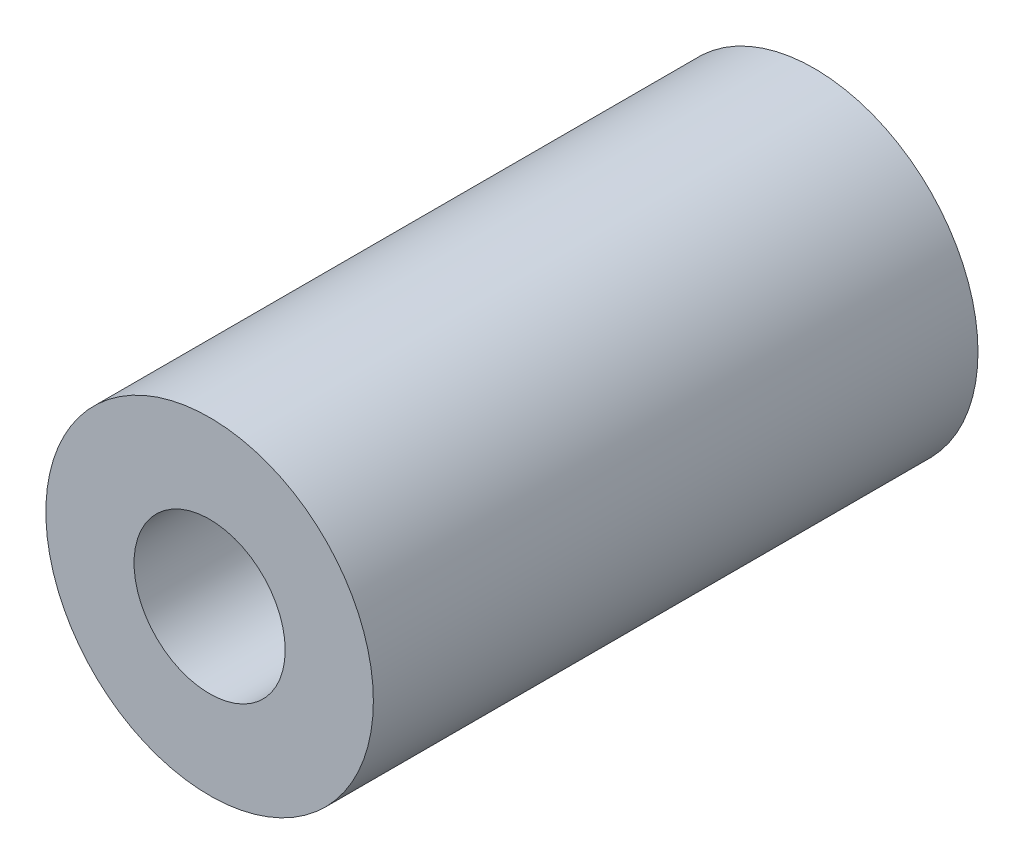
ISO-10303-21;
HEADER;
FILE_DESCRIPTION(('STEP AP214'),'2;1');
FILE_NAME('part.step','',(''),(''),'','','');
FILE_SCHEMA(('AUTOMOTIVE_DESIGN { 1 0 10303 214 1 1 1 1 }'));
ENDSEC;
DATA;
#1=APPLICATION_CONTEXT('core data for automotive mechanical design processes');
#2=APPLICATION_PROTOCOL_DEFINITION('international standard','automotive_design',2000,#1);
#3=PRODUCT_CONTEXT('',#1,'mechanical');
#4=PRODUCT('Part','Part','',(#3));
#5=PRODUCT_RELATED_PRODUCT_CATEGORY('part','',(#4));
#6=PRODUCT_DEFINITION_FORMATION('','',#4);
#7=PRODUCT_DEFINITION_CONTEXT('part definition',#1,'design');
#8=PRODUCT_DEFINITION('design','',#6,#7);
#9=PRODUCT_DEFINITION_SHAPE('','',#8);
#10=(LENGTH_UNIT() NAMED_UNIT(*) SI_UNIT(.MILLI.,.METRE.));
#11=(NAMED_UNIT(*) PLANE_ANGLE_UNIT() SI_UNIT($,.RADIAN.));
#12=(NAMED_UNIT(*) SI_UNIT($,.STERADIAN.) SOLID_ANGLE_UNIT());
#13=UNCERTAINTY_MEASURE_WITH_UNIT(LENGTH_MEASURE(1.E-05),#10,'distance_accuracy_value','');
#14=(GEOMETRIC_REPRESENTATION_CONTEXT(3) GLOBAL_UNCERTAINTY_ASSIGNED_CONTEXT((#13)) GLOBAL_UNIT_ASSIGNED_CONTEXT((#10,
#11,#12)) REPRESENTATION_CONTEXT('',''));
#15=CARTESIAN_POINT('',(0.,0.,0.));
#16=DIRECTION('',(0.,0.,1.));
#17=DIRECTION('',(1.,0.,0.));
#18=AXIS2_PLACEMENT_3D('',#15,#16,#17);
#19=CARTESIAN_POINT('',(0.,0.,12.));
#20=DIRECTION('',(0.,0.,1.));
#21=DIRECTION('',(1.,0.,0.));
#22=AXIS2_PLACEMENT_3D('',#19,#20,#21);
#23=PLANE('',#22);
#24=CARTESIAN_POINT('',(0.,0.,12.));
#25=DIRECTION('',(0.,0.,1.));
#26=DIRECTION('',(1.,0.,0.));
#27=AXIS2_PLACEMENT_3D('',#24,#25,#26);
#28=CIRCLE('',#27,3.25);
#29=CARTESIAN_POINT('',(3.25,0.,12.));
#30=VERTEX_POINT('',#29);
#31=EDGE_CURVE('E10',#30,#30,#28,.T.);
#32=ORIENTED_EDGE('',*,*,#31,.T.);
#33=EDGE_LOOP('',(#32));
#34=FACE_BOUND('',#33,.T.);
#35=CARTESIAN_POINT('',(0.,0.,12.));
#36=DIRECTION('',(0.,0.,1.));
#37=DIRECTION('',(1.,0.,0.));
#38=AXIS2_PLACEMENT_3D('',#35,#36,#37);
#39=CIRCLE('',#38,1.5);
#40=CARTESIAN_POINT('',(1.5,0.,12.));
#41=VERTEX_POINT('',#40);
#42=EDGE_CURVE('E50',#41,#41,#39,.T.);
#43=ORIENTED_EDGE('',*,*,#42,.F.);
#44=EDGE_LOOP('',(#43));
#45=FACE_BOUND('',#44,.T.);
#46=ADVANCED_FACE('F37',(#34,#45),#23,.T.);
#47=CARTESIAN_POINT('',(0.,0.,0.));
#48=DIRECTION('',(0.,0.,1.));
#49=DIRECTION('',(1.,0.,0.));
#50=AXIS2_PLACEMENT_3D('',#47,#48,#49);
#51=PLANE('',#50);
#52=CARTESIAN_POINT('',(0.,0.,0.));
#53=DIRECTION('',(0.,0.,1.));
#54=DIRECTION('',(1.,0.,0.));
#55=AXIS2_PLACEMENT_3D('',#52,#53,#54);
#56=CIRCLE('',#55,3.25);
#57=CARTESIAN_POINT('',(3.25,0.,0.));
#58=VERTEX_POINT('',#57);
#59=EDGE_CURVE('E41',#58,#58,#56,.T.);
#60=ORIENTED_EDGE('',*,*,#59,.F.);
#61=EDGE_LOOP('',(#60));
#62=FACE_BOUND('',#61,.T.);
#63=CARTESIAN_POINT('',(0.,0.,0.));
#64=DIRECTION('',(0.,0.,1.));
#65=DIRECTION('',(1.,0.,0.));
#66=AXIS2_PLACEMENT_3D('',#63,#64,#65);
#67=CIRCLE('',#66,1.5);
#68=CARTESIAN_POINT('',(1.5,0.,0.));
#69=VERTEX_POINT('',#68);
#70=EDGE_CURVE('E52',#69,#69,#67,.T.);
#71=ORIENTED_EDGE('',*,*,#70,.T.);
#72=EDGE_LOOP('',(#71));
#73=FACE_BOUND('',#72,.T.);
#74=ADVANCED_FACE('F64',(#62,#73),#51,.F.);
#75=CARTESIAN_POINT('',(0.,0.,12.));
#76=DIRECTION('',(0.,0.,-1.));
#77=DIRECTION('',(-1.,0.,0.));
#78=AXIS2_PLACEMENT_3D('',#75,#76,#77);
#79=CYLINDRICAL_SURFACE('',#78,3.25);
#80=ORIENTED_EDGE('',*,*,#31,.F.);
#81=EDGE_LOOP('',(#80));
#82=FACE_BOUND('',#81,.T.);
#83=ORIENTED_EDGE('',*,*,#59,.T.);
#84=EDGE_LOOP('',(#83));
#85=FACE_BOUND('',#84,.T.);
#86=ADVANCED_FACE('F39',(#82,#85),#79,.T.);
#87=CARTESIAN_POINT('',(0.,0.,12.));
#88=DIRECTION('',(0.,0.,-1.));
#89=DIRECTION('',(-1.,0.,0.));
#90=AXIS2_PLACEMENT_3D('',#87,#88,#89);
#91=CYLINDRICAL_SURFACE('',#90,1.5);
#92=ORIENTED_EDGE('',*,*,#42,.T.);
#93=EDGE_LOOP('',(#92));
#94=FACE_BOUND('',#93,.T.);
#95=ORIENTED_EDGE('',*,*,#70,.F.);
#96=EDGE_LOOP('',(#95));
#97=FACE_BOUND('',#96,.T.);
#98=ADVANCED_FACE('F60',(#94,#97),#91,.F.);
#99=CLOSED_SHELL('',(#46,#74,#86,#98));
#100=MANIFOLD_SOLID_BREP('B2',#99);
#101=ADVANCED_BREP_SHAPE_REPRESENTATION('',(#18,#100),#14);
#102=SHAPE_DEFINITION_REPRESENTATION(#9,#101);
ENDSEC;
END-ISO-10303-21;
